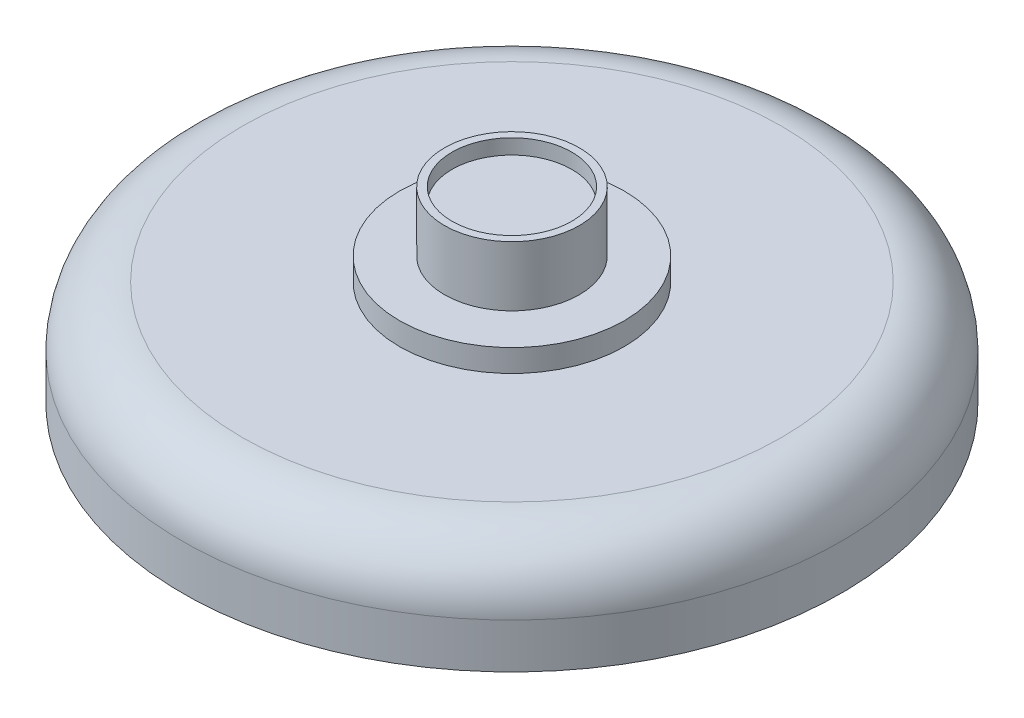
ISO-10303-21;
HEADER;
FILE_DESCRIPTION(('STEP AP214'),'2;1');
FILE_NAME('part.step','',(''),(''),'','','');
FILE_SCHEMA(('AUTOMOTIVE_DESIGN { 1 0 10303 214 1 1 1 1 }'));
ENDSEC;
DATA;
#1=APPLICATION_CONTEXT('core data for automotive mechanical design processes');
#2=APPLICATION_PROTOCOL_DEFINITION('international standard','automotive_design',2000,#1);
#3=PRODUCT_CONTEXT('',#1,'mechanical');
#4=PRODUCT('Part','Part','',(#3));
#5=PRODUCT_RELATED_PRODUCT_CATEGORY('part','',(#4));
#6=PRODUCT_DEFINITION_FORMATION('','',#4);
#7=PRODUCT_DEFINITION_CONTEXT('part definition',#1,'design');
#8=PRODUCT_DEFINITION('design','',#6,#7);
#9=PRODUCT_DEFINITION_SHAPE('','',#8);
#10=(LENGTH_UNIT() NAMED_UNIT(*) SI_UNIT(.MILLI.,.METRE.));
#11=(NAMED_UNIT(*) PLANE_ANGLE_UNIT() SI_UNIT($,.RADIAN.));
#12=(NAMED_UNIT(*) SI_UNIT($,.STERADIAN.) SOLID_ANGLE_UNIT());
#13=UNCERTAINTY_MEASURE_WITH_UNIT(LENGTH_MEASURE(1.E-05),#10,'distance_accuracy_value','');
#14=(GEOMETRIC_REPRESENTATION_CONTEXT(3) GLOBAL_UNCERTAINTY_ASSIGNED_CONTEXT((#13)) GLOBAL_UNIT_ASSIGNED_CONTEXT((#10,
#11,#12)) REPRESENTATION_CONTEXT('',''));
#15=CARTESIAN_POINT('',(0.,0.,0.));
#16=DIRECTION('',(0.,0.,1.));
#17=DIRECTION('',(1.,0.,0.));
#18=AXIS2_PLACEMENT_3D('',#15,#16,#17);
#19=CARTESIAN_POINT('',(0.,-3.,0.));
#20=DIRECTION('',(0.,-1.,0.));
#21=DIRECTION('',(0.,0.,-1.));
#22=AXIS2_PLACEMENT_3D('',#19,#20,#21);
#23=PLANE('',#22);
#24=CARTESIAN_POINT('',(0.,-3.,0.));
#25=DIRECTION('',(0.,-1.,0.));
#26=DIRECTION('',(0.,0.,-1.));
#27=AXIS2_PLACEMENT_3D('',#24,#25,#26);
#28=CIRCLE('',#27,7.5);
#29=CARTESIAN_POINT('',(0.,-3.,-7.5));
#30=VERTEX_POINT('',#29);
#31=EDGE_CURVE('E70',#30,#30,#28,.T.);
#32=ORIENTED_EDGE('',*,*,#31,.F.);
#33=EDGE_LOOP('',(#32));
#34=FACE_BOUND('',#33,.T.);
#35=CARTESIAN_POINT('',(0.,-3.,0.));
#36=DIRECTION('',(0.,-1.,0.));
#37=DIRECTION('',(0.,0.,-1.));
#38=AXIS2_PLACEMENT_3D('',#35,#36,#37);
#39=CIRCLE('',#38,4.5);
#40=CARTESIAN_POINT('',(0.,-3.,-4.5));
#41=VERTEX_POINT('',#40);
#42=EDGE_CURVE('E73',#41,#41,#39,.F.);
#43=ORIENTED_EDGE('',*,*,#42,.F.);
#44=EDGE_LOOP('',(#43));
#45=FACE_BOUND('',#44,.T.);
#46=ADVANCED_FACE('F41',(#34,#45),#23,.F.);
#47=CARTESIAN_POINT('',(0.,-11.5,0.));
#48=DIRECTION('',(0.,-1.,0.));
#49=DIRECTION('',(0.,0.,-1.));
#50=AXIS2_PLACEMENT_3D('',#47,#48,#49);
#51=PLANE('',#50);
#52=CARTESIAN_POINT('',(0.,-11.5,0.));
#53=DIRECTION('',(0.,-1.,0.));
#54=DIRECTION('',(0.,0.,-1.));
#55=AXIS2_PLACEMENT_3D('',#52,#53,#54);
#56=CIRCLE('',#55,4.);
#57=CARTESIAN_POINT('',(0.,-11.5,-4.));
#58=VERTEX_POINT('',#57);
#59=EDGE_CURVE('E10',#58,#58,#56,.T.);
#60=ORIENTED_EDGE('',*,*,#59,.F.);
#61=EDGE_LOOP('',(#60));
#62=FACE_BOUND('',#61,.T.);
#63=CARTESIAN_POINT('',(0.,-11.5,0.));
#64=DIRECTION('',(0.,-1.,0.));
#65=DIRECTION('',(0.,0.,-1.));
#66=AXIS2_PLACEMENT_3D('',#63,#64,#65);
#67=CIRCLE('',#66,22.);
#68=CARTESIAN_POINT('',(0.,-11.5,-22.));
#69=VERTEX_POINT('',#68);
#70=EDGE_CURVE('E67',#69,#69,#67,.T.);
#71=ORIENTED_EDGE('',*,*,#70,.T.);
#72=EDGE_LOOP('',(#71));
#73=FACE_BOUND('',#72,.T.);
#74=ADVANCED_FACE('F94',(#62,#73),#51,.T.);
#75=CARTESIAN_POINT('',(0.,-11.5,0.));
#76=DIRECTION('',(0.,1.,0.));
#77=DIRECTION('',(0.,0.,1.));
#78=AXIS2_PLACEMENT_3D('',#75,#76,#77);
#79=CYLINDRICAL_SURFACE('',#78,22.);
#80=CARTESIAN_POINT('',(0.,-8.5,0.));
#81=DIRECTION('',(0.,-1.,0.));
#82=DIRECTION('',(0.,0.,-1.));
#83=AXIS2_PLACEMENT_3D('',#80,#81,#82);
#84=CIRCLE('',#83,22.);
#85=CARTESIAN_POINT('',(0.,-8.5,-22.));
#86=VERTEX_POINT('',#85);
#87=EDGE_CURVE('E52',#86,#86,#84,.T.);
#88=ORIENTED_EDGE('',*,*,#87,.T.);
#89=EDGE_LOOP('',(#88));
#90=FACE_BOUND('',#89,.T.);
#91=ORIENTED_EDGE('',*,*,#70,.F.);
#92=EDGE_LOOP('',(#91));
#93=FACE_BOUND('',#92,.T.);
#94=ADVANCED_FACE('F102',(#90,#93),#79,.T.);
#95=CARTESIAN_POINT('',(0.,-4.5,0.));
#96=DIRECTION('',(0.,-1.,0.));
#97=DIRECTION('',(0.,0.,-1.));
#98=AXIS2_PLACEMENT_3D('',#95,#96,#97);
#99=PLANE('',#98);
#100=CARTESIAN_POINT('',(0.,-4.5,0.));
#101=DIRECTION('',(0.,-1.,0.));
#102=DIRECTION('',(0.,0.,-1.));
#103=AXIS2_PLACEMENT_3D('',#100,#101,#102);
#104=CIRCLE('',#103,18.);
#105=CARTESIAN_POINT('',(0.,-4.5,-18.));
#106=VERTEX_POINT('',#105);
#107=EDGE_CURVE('E48',#106,#106,#104,.F.);
#108=ORIENTED_EDGE('',*,*,#107,.T.);
#109=EDGE_LOOP('',(#108));
#110=FACE_BOUND('',#109,.T.);
#111=CARTESIAN_POINT('',(0.,-4.5,0.));
#112=DIRECTION('',(0.,-1.,0.));
#113=DIRECTION('',(0.,0.,-1.));
#114=AXIS2_PLACEMENT_3D('',#111,#112,#113);
#115=CIRCLE('',#114,7.5);
#116=CARTESIAN_POINT('',(0.,-4.5,-7.5));
#117=VERTEX_POINT('',#116);
#118=EDGE_CURVE('E64',#117,#117,#115,.T.);
#119=ORIENTED_EDGE('',*,*,#118,.T.);
#120=EDGE_LOOP('',(#119));
#121=FACE_BOUND('',#120,.T.);
#122=ADVANCED_FACE('F110',(#110,#121),#99,.F.);
#123=CARTESIAN_POINT('',(0.,-4.5,0.));
#124=DIRECTION('',(0.,1.,0.));
#125=DIRECTION('',(0.,0.,1.));
#126=AXIS2_PLACEMENT_3D('',#123,#124,#125);
#127=CYLINDRICAL_SURFACE('',#126,7.5);
#128=ORIENTED_EDGE('',*,*,#118,.F.);
#129=EDGE_LOOP('',(#128));
#130=FACE_BOUND('',#129,.T.);
#131=ORIENTED_EDGE('',*,*,#31,.T.);
#132=EDGE_LOOP('',(#131));
#133=FACE_BOUND('',#132,.T.);
#134=ADVANCED_FACE('F113',(#130,#133),#127,.T.);
#135=CARTESIAN_POINT('',(0.,-8.5,0.));
#136=DIRECTION('',(0.,-1.,0.));
#137=DIRECTION('',(0.,0.,-1.));
#138=AXIS2_PLACEMENT_3D('',#135,#136,#137);
#139=TOROIDAL_SURFACE('',#138,18.,4.);
#140=ORIENTED_EDGE('',*,*,#107,.F.);
#141=EDGE_LOOP('',(#140));
#142=FACE_BOUND('',#141,.T.);
#143=ORIENTED_EDGE('',*,*,#87,.F.);
#144=EDGE_LOOP('',(#143));
#145=FACE_BOUND('',#144,.T.);
#146=ADVANCED_FACE('F43',(#142,#145),#139,.T.);
#147=CARTESIAN_POINT('',(0.,-28.1632511618671,0.));
#148=DIRECTION('',(0.,1.,0.));
#149=DIRECTION('',(0.,0.,1.));
#150=AXIS2_PLACEMENT_3D('',#147,#148,#149);
#151=CYLINDRICAL_SURFACE('',#150,4.5);
#152=CARTESIAN_POINT('',(0.,1.,0.));
#153=DIRECTION('',(0.,1.,0.));
#154=DIRECTION('',(0.,0.,1.));
#155=AXIS2_PLACEMENT_3D('',#152,#153,#154);
#156=CIRCLE('',#155,4.5);
#157=CARTESIAN_POINT('',(0.,1.,4.5));
#158=VERTEX_POINT('',#157);
#159=EDGE_CURVE('E76',#158,#158,#156,.T.);
#160=ORIENTED_EDGE('',*,*,#159,.F.);
#161=EDGE_LOOP('',(#160));
#162=FACE_BOUND('',#161,.T.);
#163=ORIENTED_EDGE('',*,*,#42,.T.);
#164=EDGE_LOOP('',(#163));
#165=FACE_BOUND('',#164,.T.);
#166=ADVANCED_FACE('F108',(#162,#165),#151,.T.);
#167=CARTESIAN_POINT('',(0.,0.,0.));
#168=DIRECTION('',(0.,-1.,0.));
#169=DIRECTION('',(0.,0.,-1.));
#170=AXIS2_PLACEMENT_3D('',#167,#168,#169);
#171=PLANE('',#170);
#172=CARTESIAN_POINT('',(0.,0.,0.));
#173=DIRECTION('',(0.,-1.,0.));
#174=DIRECTION('',(0.,0.,-1.));
#175=AXIS2_PLACEMENT_3D('',#172,#173,#174);
#176=CIRCLE('',#175,4.);
#177=CARTESIAN_POINT('',(0.,0.,-4.));
#178=VERTEX_POINT('',#177);
#179=EDGE_CURVE('E61',#178,#178,#176,.F.);
#180=ORIENTED_EDGE('',*,*,#179,.T.);
#181=EDGE_LOOP('',(#180));
#182=FACE_BOUND('',#181,.T.);
#183=ADVANCED_FACE('F120',(#182),#171,.F.);
#184=CARTESIAN_POINT('',(0.,-0.5,0.));
#185=DIRECTION('',(0.,1.,0.));
#186=DIRECTION('',(0.,0.,1.));
#187=AXIS2_PLACEMENT_3D('',#184,#185,#186);
#188=CYLINDRICAL_SURFACE('',#187,4.);
#189=ORIENTED_EDGE('',*,*,#179,.F.);
#190=EDGE_LOOP('',(#189));
#191=FACE_BOUND('',#190,.T.);
#192=CARTESIAN_POINT('',(0.,1.,0.));
#193=DIRECTION('',(0.,1.,0.));
#194=DIRECTION('',(0.,0.,1.));
#195=AXIS2_PLACEMENT_3D('',#192,#193,#194);
#196=CIRCLE('',#195,4.);
#197=CARTESIAN_POINT('',(0.,1.,4.));
#198=VERTEX_POINT('',#197);
#199=EDGE_CURVE('E56',#198,#198,#196,.F.);
#200=ORIENTED_EDGE('',*,*,#199,.F.);
#201=EDGE_LOOP('',(#200));
#202=FACE_BOUND('',#201,.T.);
#203=ADVANCED_FACE('F123',(#191,#202),#188,.F.);
#204=CARTESIAN_POINT('',(0.,1.,0.));
#205=DIRECTION('',(0.,1.,0.));
#206=DIRECTION('',(0.,0.,1.));
#207=AXIS2_PLACEMENT_3D('',#204,#205,#206);
#208=PLANE('',#207);
#209=ORIENTED_EDGE('',*,*,#199,.T.);
#210=EDGE_LOOP('',(#209));
#211=FACE_BOUND('',#210,.T.);
#212=ORIENTED_EDGE('',*,*,#159,.T.);
#213=EDGE_LOOP('',(#212));
#214=FACE_BOUND('',#213,.T.);
#215=ADVANCED_FACE('F91',(#211,#214),#208,.T.);
#216=CARTESIAN_POINT('',(0.,-18.,0.));
#217=DIRECTION('',(0.,1.,0.));
#218=DIRECTION('',(0.,0.,1.));
#219=AXIS2_PLACEMENT_3D('',#216,#217,#218);
#220=CYLINDRICAL_SURFACE('',#219,4.);
#221=ORIENTED_EDGE('',*,*,#59,.T.);
#222=EDGE_LOOP('',(#221));
#223=FACE_BOUND('',#222,.T.);
#224=CARTESIAN_POINT('',(0.,-18.,0.));
#225=DIRECTION('',(0.,1.,0.));
#226=DIRECTION('',(0.,0.,1.));
#227=AXIS2_PLACEMENT_3D('',#224,#225,#226);
#228=CIRCLE('',#227,4.);
#229=CARTESIAN_POINT('',(0.,-18.,4.));
#230=VERTEX_POINT('',#229);
#231=EDGE_CURVE('E79',#230,#230,#228,.T.);
#232=ORIENTED_EDGE('',*,*,#231,.T.);
#233=EDGE_LOOP('',(#232));
#234=FACE_BOUND('',#233,.T.);
#235=ADVANCED_FACE('F83',(#223,#234),#220,.T.);
#236=CARTESIAN_POINT('',(0.,-18.,0.));
#237=DIRECTION('',(0.,1.,0.));
#238=DIRECTION('',(0.,0.,1.));
#239=AXIS2_PLACEMENT_3D('',#236,#237,#238);
#240=PLANE('',#239);
#241=ORIENTED_EDGE('',*,*,#231,.F.);
#242=EDGE_LOOP('',(#241));
#243=FACE_BOUND('',#242,.T.);
#244=ADVANCED_FACE('F85',(#243),#240,.F.);
#245=CLOSED_SHELL('',(#46,#74,#94,#122,#134,#146,#166,#183,#203,#215,#235,#244));
#246=MANIFOLD_SOLID_BREP('B2',#245);
#247=ADVANCED_BREP_SHAPE_REPRESENTATION('',(#18,#246),#14);
#248=SHAPE_DEFINITION_REPRESENTATION(#9,#247);
ENDSEC;
END-ISO-10303-21;
